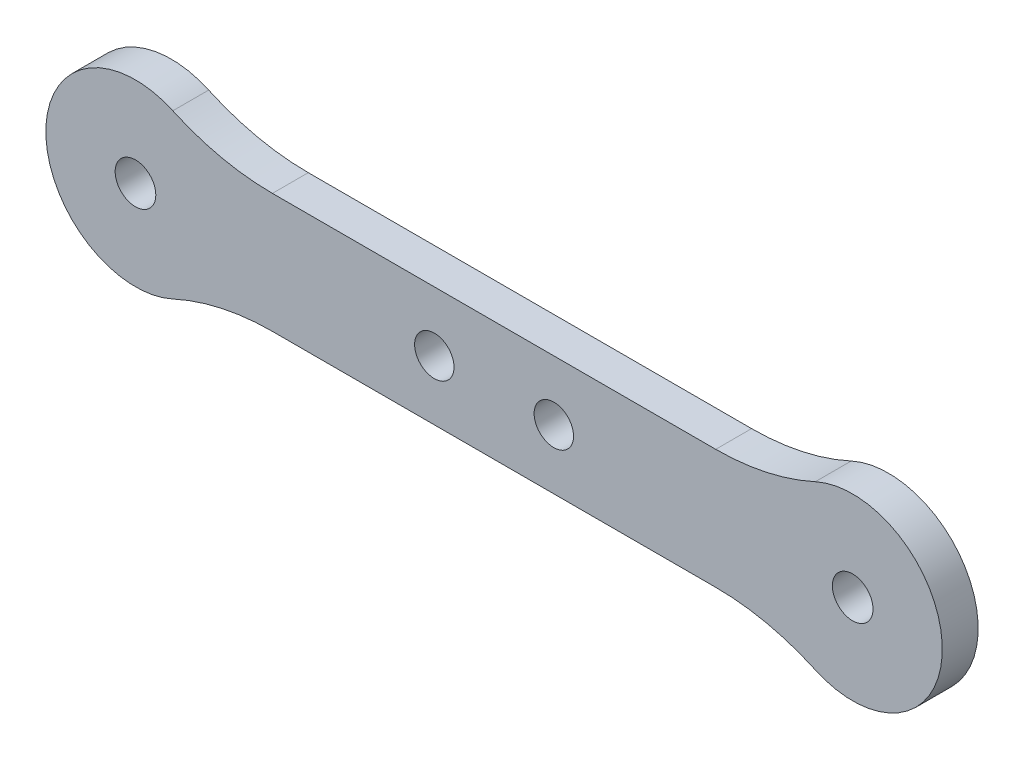
ISO-10303-21;
HEADER;
FILE_DESCRIPTION(('STEP AP214'),'2;1');
FILE_NAME('part.step','',(''),(''),'','','');
FILE_SCHEMA(('AUTOMOTIVE_DESIGN { 1 0 10303 214 1 1 1 1 }'));
ENDSEC;
DATA;
#1=APPLICATION_CONTEXT('core data for automotive mechanical design processes');
#2=APPLICATION_PROTOCOL_DEFINITION('international standard','automotive_design',2000,#1);
#3=PRODUCT_CONTEXT('',#1,'mechanical');
#4=PRODUCT('Part','Part','',(#3));
#5=PRODUCT_RELATED_PRODUCT_CATEGORY('part','',(#4));
#6=PRODUCT_DEFINITION_FORMATION('','',#4);
#7=PRODUCT_DEFINITION_CONTEXT('part definition',#1,'design');
#8=PRODUCT_DEFINITION('design','',#6,#7);
#9=PRODUCT_DEFINITION_SHAPE('','',#8);
#10=(LENGTH_UNIT() NAMED_UNIT(*) SI_UNIT(.MILLI.,.METRE.));
#11=(NAMED_UNIT(*) PLANE_ANGLE_UNIT() SI_UNIT($,.RADIAN.));
#12=(NAMED_UNIT(*) SI_UNIT($,.STERADIAN.) SOLID_ANGLE_UNIT());
#13=UNCERTAINTY_MEASURE_WITH_UNIT(LENGTH_MEASURE(1.E-05),#10,'distance_accuracy_value','');
#14=(GEOMETRIC_REPRESENTATION_CONTEXT(3) GLOBAL_UNCERTAINTY_ASSIGNED_CONTEXT((#13)) GLOBAL_UNIT_ASSIGNED_CONTEXT((#10,
#11,#12)) REPRESENTATION_CONTEXT('',''));
#15=CARTESIAN_POINT('',(0.,0.,0.));
#16=DIRECTION('',(0.,0.,1.));
#17=DIRECTION('',(1.,0.,0.));
#18=AXIS2_PLACEMENT_3D('',#15,#16,#17);
#19=CARTESIAN_POINT('',(60.,0.,3.));
#20=DIRECTION('',(0.,0.,-1.));
#21=DIRECTION('',(-1.,0.,0.));
#22=AXIS2_PLACEMENT_3D('',#19,#20,#21);
#23=CYLINDRICAL_SURFACE('',#22,7.5);
#24=CARTESIAN_POINT('',(60.,0.,3.));
#25=DIRECTION('',(0.,0.,1.));
#26=DIRECTION('',(1.,0.,0.));
#27=AXIS2_PLACEMENT_3D('',#24,#25,#26);
#28=CIRCLE('',#27,7.5);
#29=CARTESIAN_POINT('',(56.875516571621,6.81818181818182,3.));
#30=VERTEX_POINT('',#29);
#31=CARTESIAN_POINT('',(56.875516571621,-6.81818181818181,3.));
#32=VERTEX_POINT('',#31);
#33=EDGE_CURVE('E148',#30,#32,#28,.F.);
#34=ORIENTED_EDGE('',*,*,#33,.T.);
#35=DIRECTION('',(0.,0.,-1.));
#36=VECTOR('',#35,1.);
#37=CARTESIAN_POINT('',(56.875516571621,-6.81818181818181,3.));
#38=LINE('',#37,#36);
#39=CARTESIAN_POINT('',(56.875516571621,-6.81818181818181,0.));
#40=VERTEX_POINT('',#39);
#41=EDGE_CURVE('E156',#32,#40,#38,.T.);
#42=ORIENTED_EDGE('',*,*,#41,.T.);
#43=CARTESIAN_POINT('',(60.,0.,0.));
#44=DIRECTION('',(0.,0.,1.));
#45=DIRECTION('',(1.,0.,0.));
#46=AXIS2_PLACEMENT_3D('',#43,#44,#45);
#47=CIRCLE('',#46,7.5);
#48=CARTESIAN_POINT('',(56.875516571621,6.81818181818182,0.));
#49=VERTEX_POINT('',#48);
#50=EDGE_CURVE('E172',#49,#40,#47,.F.);
#51=ORIENTED_EDGE('',*,*,#50,.F.);
#52=DIRECTION('',(0.,0.,-1.));
#53=VECTOR('',#52,1.);
#54=CARTESIAN_POINT('',(56.875516571621,6.81818181818182,3.));
#55=LINE('',#54,#53);
#56=EDGE_CURVE('E154',#49,#30,#55,.F.);
#57=ORIENTED_EDGE('',*,*,#56,.T.);
#58=EDGE_LOOP('',(#34,#42,#51,#57));
#59=FACE_BOUND('',#58,.T.);
#60=ADVANCED_FACE('F35',(#59),#23,.T.);
#61=CARTESIAN_POINT('',(0.,4.99999999999999,3.));
#62=DIRECTION('',(0.,1.,0.));
#63=DIRECTION('',(-1.,0.,0.));
#64=AXIS2_PLACEMENT_3D('',#61,#62,#63);
#65=PLANE('',#64);
#66=DIRECTION('',(1.,0.,0.));
#67=VECTOR('',#66,1.);
#68=CARTESIAN_POINT('',(0.,4.99999999999999,3.));
#69=LINE('',#68,#67);
#70=CARTESIAN_POINT('',(11.4564392373896,4.99999999999999,3.));
#71=VERTEX_POINT('',#70);
#72=CARTESIAN_POINT('',(48.5435607626104,5.,3.));
#73=VERTEX_POINT('',#72);
#74=EDGE_CURVE('E179',#71,#73,#69,.T.);
#75=ORIENTED_EDGE('',*,*,#74,.T.);
#76=DIRECTION('',(0.,0.,1.));
#77=VECTOR('',#76,1.);
#78=CARTESIAN_POINT('',(48.5435607626104,5.,0.));
#79=LINE('',#78,#77);
#80=CARTESIAN_POINT('',(48.5435607626104,5.,0.));
#81=VERTEX_POINT('',#80);
#82=EDGE_CURVE('E112',#73,#81,#79,.F.);
#83=ORIENTED_EDGE('',*,*,#82,.T.);
#84=DIRECTION('',(1.,0.,0.));
#85=VECTOR('',#84,1.);
#86=CARTESIAN_POINT('',(0.,4.99999999999999,0.));
#87=LINE('',#86,#85);
#88=CARTESIAN_POINT('',(11.4564392373896,4.99999999999999,0.));
#89=VERTEX_POINT('',#88);
#90=EDGE_CURVE('E136',#89,#81,#87,.T.);
#91=ORIENTED_EDGE('',*,*,#90,.F.);
#92=DIRECTION('',(0.,0.,-1.));
#93=VECTOR('',#92,1.);
#94=CARTESIAN_POINT('',(11.4564392373896,4.99999999999999,3.));
#95=LINE('',#94,#93);
#96=EDGE_CURVE('E57',#89,#71,#95,.F.);
#97=ORIENTED_EDGE('',*,*,#96,.T.);
#98=EDGE_LOOP('',(#75,#83,#91,#97));
#99=FACE_BOUND('',#98,.T.);
#100=ADVANCED_FACE('F170',(#99),#65,.T.);
#101=CARTESIAN_POINT('',(0.,0.,3.));
#102=DIRECTION('',(0.,0.,-1.));
#103=DIRECTION('',(-1.,0.,0.));
#104=AXIS2_PLACEMENT_3D('',#101,#102,#103);
#105=CYLINDRICAL_SURFACE('',#104,7.5);
#106=CARTESIAN_POINT('',(0.,0.,0.));
#107=DIRECTION('',(0.,0.,1.));
#108=DIRECTION('',(1.,0.,0.));
#109=AXIS2_PLACEMENT_3D('',#106,#107,#108);
#110=CIRCLE('',#109,7.5);
#111=CARTESIAN_POINT('',(3.12448342837898,6.81818181818182,0.));
#112=VERTEX_POINT('',#111);
#113=CARTESIAN_POINT('',(3.12448342837898,-6.81818181818182,0.));
#114=VERTEX_POINT('',#113);
#115=EDGE_CURVE('E131',#112,#114,#110,.T.);
#116=ORIENTED_EDGE('',*,*,#115,.T.);
#117=DIRECTION('',(0.,0.,-1.));
#118=VECTOR('',#117,1.);
#119=CARTESIAN_POINT('',(3.12448342837898,-6.81818181818182,3.));
#120=LINE('',#119,#118);
#121=CARTESIAN_POINT('',(3.12448342837898,-6.81818181818182,3.));
#122=VERTEX_POINT('',#121);
#123=EDGE_CURVE('E106',#114,#122,#120,.F.);
#124=ORIENTED_EDGE('',*,*,#123,.T.);
#125=CARTESIAN_POINT('',(0.,0.,3.));
#126=DIRECTION('',(0.,0.,1.));
#127=DIRECTION('',(1.,0.,0.));
#128=AXIS2_PLACEMENT_3D('',#125,#126,#127);
#129=CIRCLE('',#128,7.5);
#130=CARTESIAN_POINT('',(3.12448342837898,6.81818181818182,3.));
#131=VERTEX_POINT('',#130);
#132=EDGE_CURVE('E178',#131,#122,#129,.T.);
#133=ORIENTED_EDGE('',*,*,#132,.F.);
#134=DIRECTION('',(0.,0.,-1.));
#135=VECTOR('',#134,1.);
#136=CARTESIAN_POINT('',(3.12448342837898,6.81818181818182,3.));
#137=LINE('',#136,#135);
#138=EDGE_CURVE('E122',#131,#112,#137,.T.);
#139=ORIENTED_EDGE('',*,*,#138,.T.);
#140=EDGE_LOOP('',(#116,#124,#133,#139));
#141=FACE_BOUND('',#140,.T.);
#142=ADVANCED_FACE('F181',(#141),#105,.T.);
#143=CARTESIAN_POINT('',(35.,0.,3.));
#144=DIRECTION('',(0.,0.,-1.));
#145=DIRECTION('',(-1.,0.,0.));
#146=AXIS2_PLACEMENT_3D('',#143,#144,#145);
#147=CYLINDRICAL_SURFACE('',#146,1.65);
#148=CARTESIAN_POINT('',(35.,0.,3.));
#149=DIRECTION('',(0.,0.,1.));
#150=DIRECTION('',(1.,0.,0.));
#151=AXIS2_PLACEMENT_3D('',#148,#149,#150);
#152=CIRCLE('',#151,1.65);
#153=CARTESIAN_POINT('',(36.65,0.,3.));
#154=VERTEX_POINT('',#153);
#155=EDGE_CURVE('E193',#154,#154,#152,.T.);
#156=ORIENTED_EDGE('',*,*,#155,.T.);
#157=EDGE_LOOP('',(#156));
#158=FACE_BOUND('',#157,.T.);
#159=CARTESIAN_POINT('',(35.,0.,0.));
#160=DIRECTION('',(0.,0.,1.));
#161=DIRECTION('',(1.,0.,0.));
#162=AXIS2_PLACEMENT_3D('',#159,#160,#161);
#163=CIRCLE('',#162,1.65);
#164=CARTESIAN_POINT('',(36.65,0.,0.));
#165=VERTEX_POINT('',#164);
#166=EDGE_CURVE('E142',#165,#165,#163,.T.);
#167=ORIENTED_EDGE('',*,*,#166,.F.);
#168=EDGE_LOOP('',(#167));
#169=FACE_BOUND('',#168,.T.);
#170=ADVANCED_FACE('F235',(#158,#169),#147,.F.);
#171=CARTESIAN_POINT('',(25.,0.,3.));
#172=DIRECTION('',(0.,0.,-1.));
#173=DIRECTION('',(-1.,0.,0.));
#174=AXIS2_PLACEMENT_3D('',#171,#172,#173);
#175=CYLINDRICAL_SURFACE('',#174,1.65);
#176=CARTESIAN_POINT('',(25.,0.,3.));
#177=DIRECTION('',(0.,0.,1.));
#178=DIRECTION('',(1.,0.,0.));
#179=AXIS2_PLACEMENT_3D('',#176,#177,#178);
#180=CIRCLE('',#179,1.65);
#181=CARTESIAN_POINT('',(26.65,0.,3.));
#182=VERTEX_POINT('',#181);
#183=EDGE_CURVE('E190',#182,#182,#180,.T.);
#184=ORIENTED_EDGE('',*,*,#183,.T.);
#185=EDGE_LOOP('',(#184));
#186=FACE_BOUND('',#185,.T.);
#187=CARTESIAN_POINT('',(25.,0.,0.));
#188=DIRECTION('',(0.,0.,1.));
#189=DIRECTION('',(1.,0.,0.));
#190=AXIS2_PLACEMENT_3D('',#187,#188,#189);
#191=CIRCLE('',#190,1.65);
#192=CARTESIAN_POINT('',(26.65,0.,0.));
#193=VERTEX_POINT('',#192);
#194=EDGE_CURVE('E134',#193,#193,#191,.T.);
#195=ORIENTED_EDGE('',*,*,#194,.F.);
#196=EDGE_LOOP('',(#195));
#197=FACE_BOUND('',#196,.T.);
#198=ADVANCED_FACE('F238',(#186,#197),#175,.F.);
#199=CARTESIAN_POINT('',(0.,0.,3.));
#200=DIRECTION('',(0.,0.,-1.));
#201=DIRECTION('',(-1.,0.,0.));
#202=AXIS2_PLACEMENT_3D('',#199,#200,#201);
#203=CYLINDRICAL_SURFACE('',#202,1.7);
#204=CARTESIAN_POINT('',(0.,0.,3.));
#205=DIRECTION('',(0.,0.,1.));
#206=DIRECTION('',(1.,0.,0.));
#207=AXIS2_PLACEMENT_3D('',#204,#205,#206);
#208=CIRCLE('',#207,1.7);
#209=CARTESIAN_POINT('',(1.7,0.,3.));
#210=VERTEX_POINT('',#209);
#211=EDGE_CURVE('E183',#210,#210,#208,.T.);
#212=ORIENTED_EDGE('',*,*,#211,.T.);
#213=EDGE_LOOP('',(#212));
#214=FACE_BOUND('',#213,.T.);
#215=CARTESIAN_POINT('',(0.,0.,0.));
#216=DIRECTION('',(0.,0.,1.));
#217=DIRECTION('',(1.,0.,0.));
#218=AXIS2_PLACEMENT_3D('',#215,#216,#217);
#219=CIRCLE('',#218,1.7);
#220=CARTESIAN_POINT('',(1.7,0.,0.));
#221=VERTEX_POINT('',#220);
#222=EDGE_CURVE('E130',#221,#221,#219,.T.);
#223=ORIENTED_EDGE('',*,*,#222,.F.);
#224=EDGE_LOOP('',(#223));
#225=FACE_BOUND('',#224,.T.);
#226=ADVANCED_FACE('F242',(#214,#225),#203,.F.);
#227=CARTESIAN_POINT('',(0.,-5.00000000000001,3.));
#228=DIRECTION('',(0.,1.,0.));
#229=DIRECTION('',(-1.,0.,0.));
#230=AXIS2_PLACEMENT_3D('',#227,#228,#229);
#231=PLANE('',#230);
#232=DIRECTION('',(1.,0.,0.));
#233=VECTOR('',#232,1.);
#234=CARTESIAN_POINT('',(0.,-5.00000000000001,3.));
#235=LINE('',#234,#233);
#236=CARTESIAN_POINT('',(11.4564392373896,-5.00000000000001,3.));
#237=VERTEX_POINT('',#236);
#238=CARTESIAN_POINT('',(48.5435607626104,-5.,3.));
#239=VERTEX_POINT('',#238);
#240=EDGE_CURVE('E121',#237,#239,#235,.T.);
#241=ORIENTED_EDGE('',*,*,#240,.F.);
#242=DIRECTION('',(0.,0.,1.));
#243=VECTOR('',#242,1.);
#244=CARTESIAN_POINT('',(11.4564392373896,-5.00000000000001,0.));
#245=LINE('',#244,#243);
#246=CARTESIAN_POINT('',(11.4564392373896,-5.00000000000001,0.));
#247=VERTEX_POINT('',#246);
#248=EDGE_CURVE('E105',#237,#247,#245,.F.);
#249=ORIENTED_EDGE('',*,*,#248,.T.);
#250=DIRECTION('',(1.,0.,0.));
#251=VECTOR('',#250,1.);
#252=CARTESIAN_POINT('',(0.,-5.00000000000001,0.));
#253=LINE('',#252,#251);
#254=CARTESIAN_POINT('',(48.5435607626104,-5.,0.));
#255=VERTEX_POINT('',#254);
#256=EDGE_CURVE('E118',#247,#255,#253,.T.);
#257=ORIENTED_EDGE('',*,*,#256,.T.);
#258=DIRECTION('',(0.,0.,-1.));
#259=VECTOR('',#258,1.);
#260=CARTESIAN_POINT('',(48.5435607626104,-5.,3.));
#261=LINE('',#260,#259);
#262=EDGE_CURVE('E123',#255,#239,#261,.F.);
#263=ORIENTED_EDGE('',*,*,#262,.T.);
#264=EDGE_LOOP('',(#241,#249,#257,#263));
#265=FACE_BOUND('',#264,.T.);
#266=ADVANCED_FACE('F117',(#265),#231,.F.);
#267=CARTESIAN_POINT('',(60.,0.,3.));
#268=DIRECTION('',(0.,0.,-1.));
#269=DIRECTION('',(-1.,0.,0.));
#270=AXIS2_PLACEMENT_3D('',#267,#268,#269);
#271=CYLINDRICAL_SURFACE('',#270,1.7);
#272=CARTESIAN_POINT('',(60.,0.,3.));
#273=DIRECTION('',(0.,0.,1.));
#274=DIRECTION('',(1.,0.,0.));
#275=AXIS2_PLACEMENT_3D('',#272,#273,#274);
#276=CIRCLE('',#275,1.7);
#277=CARTESIAN_POINT('',(61.7,0.,3.));
#278=VERTEX_POINT('',#277);
#279=EDGE_CURVE('E149',#278,#278,#276,.F.);
#280=ORIENTED_EDGE('',*,*,#279,.F.);
#281=EDGE_LOOP('',(#280));
#282=FACE_BOUND('',#281,.T.);
#283=CARTESIAN_POINT('',(60.,0.,0.));
#284=DIRECTION('',(0.,0.,1.));
#285=DIRECTION('',(1.,0.,0.));
#286=AXIS2_PLACEMENT_3D('',#283,#284,#285);
#287=CIRCLE('',#286,1.7);
#288=CARTESIAN_POINT('',(61.7,0.,0.));
#289=VERTEX_POINT('',#288);
#290=EDGE_CURVE('E145',#289,#289,#287,.F.);
#291=ORIENTED_EDGE('',*,*,#290,.T.);
#292=EDGE_LOOP('',(#291));
#293=FACE_BOUND('',#292,.T.);
#294=ADVANCED_FACE('F229',(#282,#293),#271,.F.);
#295=CARTESIAN_POINT('',(0.,0.,3.));
#296=DIRECTION('',(0.,0.,1.));
#297=DIRECTION('',(1.,0.,0.));
#298=AXIS2_PLACEMENT_3D('',#295,#296,#297);
#299=PLANE('',#298);
#300=ORIENTED_EDGE('',*,*,#33,.F.);
#301=CARTESIAN_POINT('',(48.5435607626104,25.,3.));
#302=DIRECTION('',(0.,0.,1.));
#303=DIRECTION('',(1.,0.,0.));
#304=AXIS2_PLACEMENT_3D('',#301,#302,#303);
#305=CIRCLE('',#304,20.);
#306=EDGE_CURVE('E50',#30,#73,#305,.F.);
#307=ORIENTED_EDGE('',*,*,#306,.T.);
#308=ORIENTED_EDGE('',*,*,#74,.F.);
#309=CARTESIAN_POINT('',(11.4564392373896,25.,3.));
#310=DIRECTION('',(0.,0.,1.));
#311=DIRECTION('',(1.,0.,0.));
#312=AXIS2_PLACEMENT_3D('',#309,#310,#311);
#313=CIRCLE('',#312,20.);
#314=EDGE_CURVE('E11',#71,#131,#313,.F.);
#315=ORIENTED_EDGE('',*,*,#314,.T.);
#316=ORIENTED_EDGE('',*,*,#132,.T.);
#317=CARTESIAN_POINT('',(11.4564392373896,-25.,3.));
#318=DIRECTION('',(0.,0.,1.));
#319=DIRECTION('',(1.,0.,0.));
#320=AXIS2_PLACEMENT_3D('',#317,#318,#319);
#321=CIRCLE('',#320,20.);
#322=EDGE_CURVE('E111',#122,#237,#321,.F.);
#323=ORIENTED_EDGE('',*,*,#322,.T.);
#324=ORIENTED_EDGE('',*,*,#240,.T.);
#325=CARTESIAN_POINT('',(48.5435607626104,-25.,3.));
#326=DIRECTION('',(0.,0.,1.));
#327=DIRECTION('',(1.,0.,0.));
#328=AXIS2_PLACEMENT_3D('',#325,#326,#327);
#329=CIRCLE('',#328,20.);
#330=EDGE_CURVE('E164',#239,#32,#329,.F.);
#331=ORIENTED_EDGE('',*,*,#330,.T.);
#332=EDGE_LOOP('',(#300,#307,#308,#315,#316,#323,#324,#331));
#333=FACE_BOUND('',#332,.T.);
#334=ORIENTED_EDGE('',*,*,#211,.F.);
#335=EDGE_LOOP('',(#334));
#336=FACE_BOUND('',#335,.T.);
#337=ORIENTED_EDGE('',*,*,#183,.F.);
#338=EDGE_LOOP('',(#337));
#339=FACE_BOUND('',#338,.T.);
#340=ORIENTED_EDGE('',*,*,#155,.F.);
#341=EDGE_LOOP('',(#340));
#342=FACE_BOUND('',#341,.T.);
#343=ORIENTED_EDGE('',*,*,#279,.T.);
#344=EDGE_LOOP('',(#343));
#345=FACE_BOUND('',#344,.T.);
#346=ADVANCED_FACE('F176',(#333,#336,#339,#342,#345),#299,.T.);
#347=CARTESIAN_POINT('',(0.,0.,0.));
#348=DIRECTION('',(0.,0.,1.));
#349=DIRECTION('',(1.,0.,0.));
#350=AXIS2_PLACEMENT_3D('',#347,#348,#349);
#351=PLANE('',#350);
#352=ORIENTED_EDGE('',*,*,#90,.T.);
#353=CARTESIAN_POINT('',(48.5435607626104,25.,0.));
#354=DIRECTION('',(0.,0.,1.));
#355=DIRECTION('',(1.,0.,0.));
#356=AXIS2_PLACEMENT_3D('',#353,#354,#355);
#357=CIRCLE('',#356,20.);
#358=EDGE_CURVE('E166',#81,#49,#357,.T.);
#359=ORIENTED_EDGE('',*,*,#358,.T.);
#360=ORIENTED_EDGE('',*,*,#50,.T.);
#361=CARTESIAN_POINT('',(48.5435607626104,-25.,0.));
#362=DIRECTION('',(0.,0.,1.));
#363=DIRECTION('',(1.,0.,0.));
#364=AXIS2_PLACEMENT_3D('',#361,#362,#363);
#365=CIRCLE('',#364,20.);
#366=EDGE_CURVE('E129',#40,#255,#365,.T.);
#367=ORIENTED_EDGE('',*,*,#366,.T.);
#368=ORIENTED_EDGE('',*,*,#256,.F.);
#369=CARTESIAN_POINT('',(11.4564392373896,-25.,0.));
#370=DIRECTION('',(0.,0.,1.));
#371=DIRECTION('',(1.,0.,0.));
#372=AXIS2_PLACEMENT_3D('',#369,#370,#371);
#373=CIRCLE('',#372,20.);
#374=EDGE_CURVE('E101',#247,#114,#373,.T.);
#375=ORIENTED_EDGE('',*,*,#374,.T.);
#376=ORIENTED_EDGE('',*,*,#115,.F.);
#377=CARTESIAN_POINT('',(11.4564392373896,25.,0.));
#378=DIRECTION('',(0.,0.,1.));
#379=DIRECTION('',(1.,0.,0.));
#380=AXIS2_PLACEMENT_3D('',#377,#378,#379);
#381=CIRCLE('',#380,20.);
#382=EDGE_CURVE('E43',#112,#89,#381,.T.);
#383=ORIENTED_EDGE('',*,*,#382,.T.);
#384=EDGE_LOOP('',(#352,#359,#360,#367,#368,#375,#376,#383));
#385=FACE_BOUND('',#384,.T.);
#386=ORIENTED_EDGE('',*,*,#222,.T.);
#387=EDGE_LOOP('',(#386));
#388=FACE_BOUND('',#387,.T.);
#389=ORIENTED_EDGE('',*,*,#194,.T.);
#390=EDGE_LOOP('',(#389));
#391=FACE_BOUND('',#390,.T.);
#392=ORIENTED_EDGE('',*,*,#166,.T.);
#393=EDGE_LOOP('',(#392));
#394=FACE_BOUND('',#393,.T.);
#395=ORIENTED_EDGE('',*,*,#290,.F.);
#396=EDGE_LOOP('',(#395));
#397=FACE_BOUND('',#396,.T.);
#398=ADVANCED_FACE('F126',(#385,#388,#391,#394,#397),#351,.F.);
#399=CARTESIAN_POINT('',(11.4564392373896,-25.,3.));
#400=DIRECTION('',(0.,0.,-1.));
#401=DIRECTION('',(-1.,0.,0.));
#402=AXIS2_PLACEMENT_3D('',#399,#400,#401);
#403=CYLINDRICAL_SURFACE('',#402,20.);
#404=ORIENTED_EDGE('',*,*,#322,.F.);
#405=ORIENTED_EDGE('',*,*,#123,.F.);
#406=ORIENTED_EDGE('',*,*,#374,.F.);
#407=ORIENTED_EDGE('',*,*,#248,.F.);
#408=EDGE_LOOP('',(#404,#405,#406,#407));
#409=FACE_BOUND('',#408,.T.);
#410=ADVANCED_FACE('F104',(#409),#403,.F.);
#411=CARTESIAN_POINT('',(48.5435607626104,-25.,3.));
#412=DIRECTION('',(0.,0.,-1.));
#413=DIRECTION('',(-1.,0.,0.));
#414=AXIS2_PLACEMENT_3D('',#411,#412,#413);
#415=CYLINDRICAL_SURFACE('',#414,20.);
#416=ORIENTED_EDGE('',*,*,#330,.F.);
#417=ORIENTED_EDGE('',*,*,#262,.F.);
#418=ORIENTED_EDGE('',*,*,#366,.F.);
#419=ORIENTED_EDGE('',*,*,#41,.F.);
#420=EDGE_LOOP('',(#416,#417,#418,#419));
#421=FACE_BOUND('',#420,.T.);
#422=ADVANCED_FACE('F206',(#421),#415,.F.);
#423=CARTESIAN_POINT('',(48.5435607626104,25.,3.));
#424=DIRECTION('',(0.,0.,-1.));
#425=DIRECTION('',(-1.,0.,0.));
#426=AXIS2_PLACEMENT_3D('',#423,#424,#425);
#427=CYLINDRICAL_SURFACE('',#426,20.);
#428=ORIENTED_EDGE('',*,*,#306,.F.);
#429=ORIENTED_EDGE('',*,*,#56,.F.);
#430=ORIENTED_EDGE('',*,*,#358,.F.);
#431=ORIENTED_EDGE('',*,*,#82,.F.);
#432=EDGE_LOOP('',(#428,#429,#430,#431));
#433=FACE_BOUND('',#432,.T.);
#434=ADVANCED_FACE('F204',(#433),#427,.F.);
#435=CARTESIAN_POINT('',(11.4564392373896,25.,3.));
#436=DIRECTION('',(0.,0.,-1.));
#437=DIRECTION('',(-1.,0.,0.));
#438=AXIS2_PLACEMENT_3D('',#435,#436,#437);
#439=CYLINDRICAL_SURFACE('',#438,20.);
#440=ORIENTED_EDGE('',*,*,#314,.F.);
#441=ORIENTED_EDGE('',*,*,#96,.F.);
#442=ORIENTED_EDGE('',*,*,#382,.F.);
#443=ORIENTED_EDGE('',*,*,#138,.F.);
#444=EDGE_LOOP('',(#440,#441,#442,#443));
#445=FACE_BOUND('',#444,.T.);
#446=ADVANCED_FACE('F37',(#445),#439,.F.);
#447=CLOSED_SHELL('',(#60,#100,#142,#170,#198,#226,#266,#294,#346,#398,#410,#422,#434,#446));
#448=MANIFOLD_SOLID_BREP('B2',#447);
#449=ADVANCED_BREP_SHAPE_REPRESENTATION('',(#18,#448),#14);
#450=SHAPE_DEFINITION_REPRESENTATION(#9,#449);
ENDSEC;
END-ISO-10303-21;
